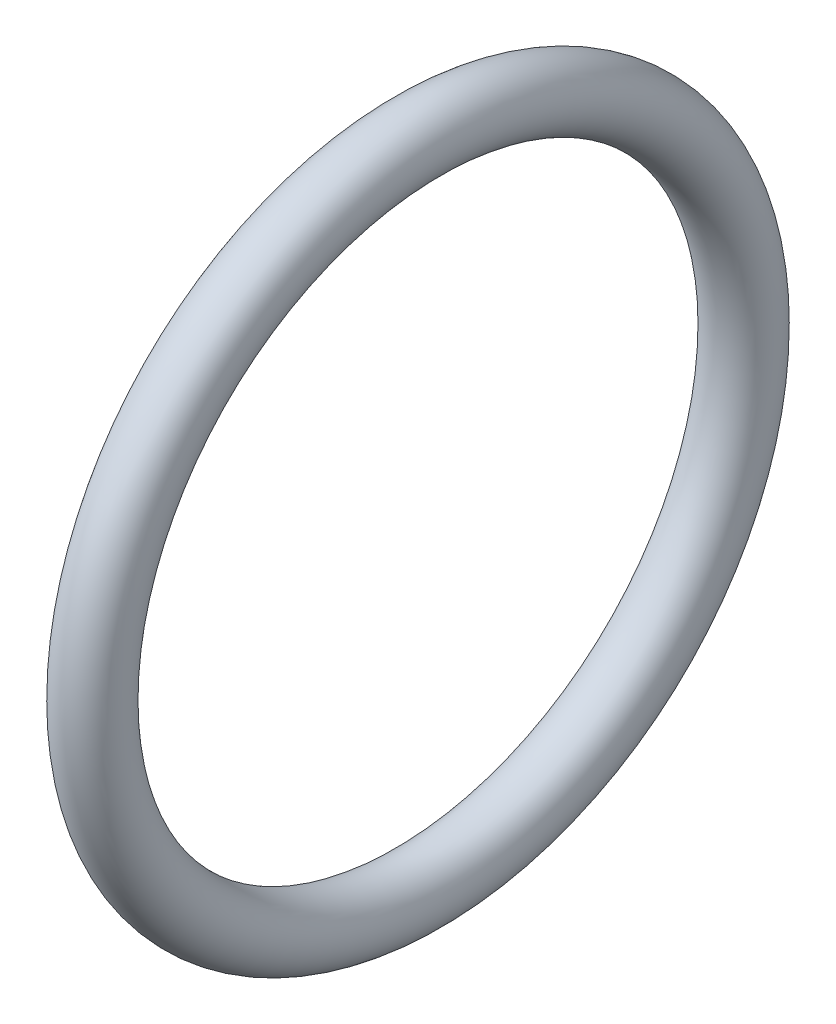
ISO-10303-21;
HEADER;
FILE_DESCRIPTION(('STEP AP214'),'2;1');
FILE_NAME('part.step','',(''),(''),'','','');
FILE_SCHEMA(('AUTOMOTIVE_DESIGN { 1 0 10303 214 1 1 1 1 }'));
ENDSEC;
DATA;
#1=APPLICATION_CONTEXT('core data for automotive mechanical design processes');
#2=APPLICATION_PROTOCOL_DEFINITION('international standard','automotive_design',2000,#1);
#3=PRODUCT_CONTEXT('',#1,'mechanical');
#4=PRODUCT('Part','Part','',(#3));
#5=PRODUCT_RELATED_PRODUCT_CATEGORY('part','',(#4));
#6=PRODUCT_DEFINITION_FORMATION('','',#4);
#7=PRODUCT_DEFINITION_CONTEXT('part definition',#1,'design');
#8=PRODUCT_DEFINITION('design','',#6,#7);
#9=PRODUCT_DEFINITION_SHAPE('','',#8);
#10=(LENGTH_UNIT() NAMED_UNIT(*) SI_UNIT(.MILLI.,.METRE.));
#11=(NAMED_UNIT(*) PLANE_ANGLE_UNIT() SI_UNIT($,.RADIAN.));
#12=(NAMED_UNIT(*) SI_UNIT($,.STERADIAN.) SOLID_ANGLE_UNIT());
#13=UNCERTAINTY_MEASURE_WITH_UNIT(LENGTH_MEASURE(1.E-05),#10,'distance_accuracy_value','');
#14=(GEOMETRIC_REPRESENTATION_CONTEXT(3) GLOBAL_UNCERTAINTY_ASSIGNED_CONTEXT((#13)) GLOBAL_UNIT_ASSIGNED_CONTEXT((#10,
#11,#12)) REPRESENTATION_CONTEXT('',''));
#15=CARTESIAN_POINT('',(0.,0.,0.));
#16=DIRECTION('',(0.,0.,1.));
#17=DIRECTION('',(1.,0.,0.));
#18=AXIS2_PLACEMENT_3D('',#15,#16,#17);
#19=CARTESIAN_POINT('',(0.,0.,0.));
#20=DIRECTION('',(-1.,0.,0.));
#21=DIRECTION('',(0.,0.,1.));
#22=AXIS2_PLACEMENT_3D('',#19,#20,#21);
#23=TOROIDAL_SURFACE('',#22,12.1,1.2);
#24=CARTESIAN_POINT('',(0.,0.,13.3));
#25=VERTEX_POINT('',#24);
#26=VERTEX_LOOP('',#25);
#27=FACE_BOUND('',#26,.T.);
#28=ADVANCED_FACE('F32',(#27),#23,.T.);
#29=CLOSED_SHELL('',(#28));
#30=MANIFOLD_SOLID_BREP('B2',#29);
#31=ADVANCED_BREP_SHAPE_REPRESENTATION('',(#18,#30),#14);
#32=SHAPE_DEFINITION_REPRESENTATION(#9,#31);
ENDSEC;
END-ISO-10303-21;
